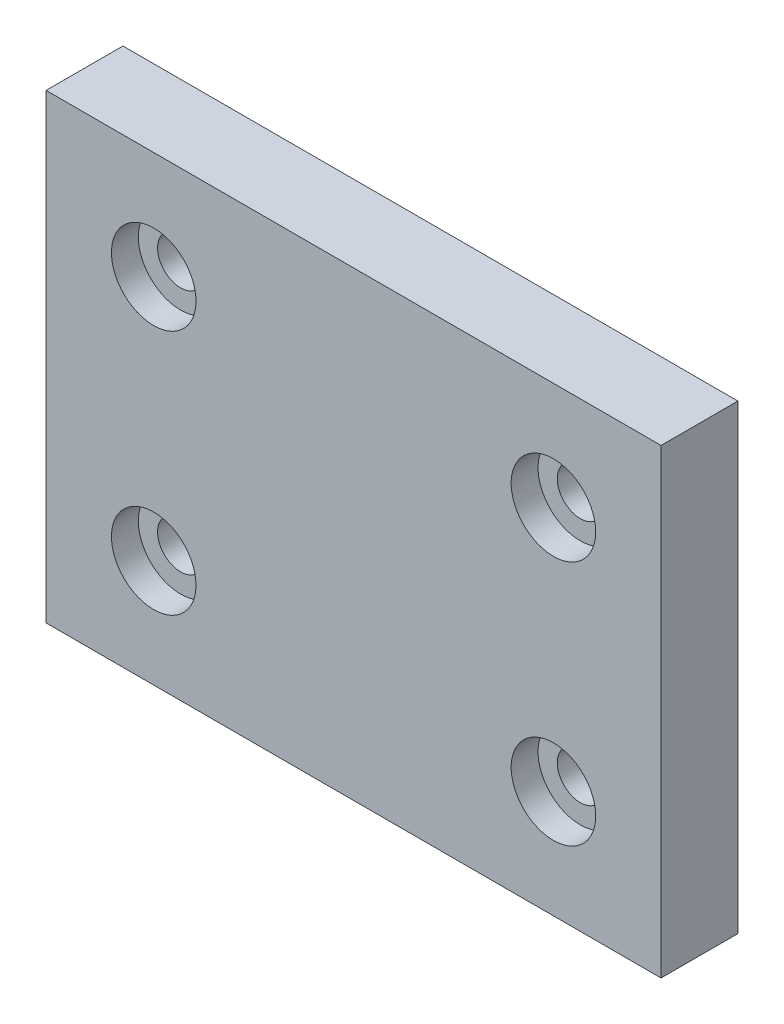
ISO-10303-21;
HEADER;
FILE_DESCRIPTION(('STEP AP214'),'2;1');
FILE_NAME('part.step','',(''),(''),'','','');
FILE_SCHEMA(('AUTOMOTIVE_DESIGN { 1 0 10303 214 1 1 1 1 }'));
ENDSEC;
DATA;
#1=APPLICATION_CONTEXT('core data for automotive mechanical design processes');
#2=APPLICATION_PROTOCOL_DEFINITION('international standard','automotive_design',2000,#1);
#3=PRODUCT_CONTEXT('',#1,'mechanical');
#4=PRODUCT('Part','Part','',(#3));
#5=PRODUCT_RELATED_PRODUCT_CATEGORY('part','',(#4));
#6=PRODUCT_DEFINITION_FORMATION('','',#4);
#7=PRODUCT_DEFINITION_CONTEXT('part definition',#1,'design');
#8=PRODUCT_DEFINITION('design','',#6,#7);
#9=PRODUCT_DEFINITION_SHAPE('','',#8);
#10=(LENGTH_UNIT() NAMED_UNIT(*) SI_UNIT(.MILLI.,.METRE.));
#11=(NAMED_UNIT(*) PLANE_ANGLE_UNIT() SI_UNIT($,.RADIAN.));
#12=(NAMED_UNIT(*) SI_UNIT($,.STERADIAN.) SOLID_ANGLE_UNIT());
#13=UNCERTAINTY_MEASURE_WITH_UNIT(LENGTH_MEASURE(1.E-05),#10,'distance_accuracy_value','');
#14=(GEOMETRIC_REPRESENTATION_CONTEXT(3) GLOBAL_UNCERTAINTY_ASSIGNED_CONTEXT((#13)) GLOBAL_UNIT_ASSIGNED_CONTEXT((#10,
#11,#12)) REPRESENTATION_CONTEXT('',''));
#15=CARTESIAN_POINT('',(0.,0.,0.));
#16=DIRECTION('',(0.,0.,1.));
#17=DIRECTION('',(1.,0.,0.));
#18=AXIS2_PLACEMENT_3D('',#15,#16,#17);
#19=CARTESIAN_POINT('',(-40.,30.,10.));
#20=DIRECTION('',(1.,0.,0.));
#21=DIRECTION('',(0.,0.,-1.));
#22=AXIS2_PLACEMENT_3D('',#19,#20,#21);
#23=PLANE('',#22);
#24=DIRECTION('',(0.,-1.,0.));
#25=VECTOR('',#24,1.);
#26=CARTESIAN_POINT('',(-40.,30.,0.));
#27=LINE('',#26,#25);
#28=CARTESIAN_POINT('',(-40.,30.,0.));
#29=VERTEX_POINT('',#28);
#30=CARTESIAN_POINT('',(-40.,-30.,0.));
#31=VERTEX_POINT('',#30);
#32=EDGE_CURVE('E125',#29,#31,#27,.T.);
#33=ORIENTED_EDGE('',*,*,#32,.T.);
#34=DIRECTION('',(0.,0.,-1.));
#35=VECTOR('',#34,1.);
#36=CARTESIAN_POINT('',(-40.,-30.,10.));
#37=LINE('',#36,#35);
#38=CARTESIAN_POINT('',(-40.,-30.,10.));
#39=VERTEX_POINT('',#38);
#40=EDGE_CURVE('E11',#39,#31,#37,.T.);
#41=ORIENTED_EDGE('',*,*,#40,.F.);
#42=DIRECTION('',(0.,-1.,0.));
#43=VECTOR('',#42,1.);
#44=CARTESIAN_POINT('',(-40.,30.,10.));
#45=LINE('',#44,#43);
#46=CARTESIAN_POINT('',(-40.,30.,10.));
#47=VERTEX_POINT('',#46);
#48=EDGE_CURVE('E106',#47,#39,#45,.T.);
#49=ORIENTED_EDGE('',*,*,#48,.F.);
#50=DIRECTION('',(0.,0.,-1.));
#51=VECTOR('',#50,1.);
#52=CARTESIAN_POINT('',(-40.,30.,10.));
#53=LINE('',#52,#51);
#54=EDGE_CURVE('E121',#47,#29,#53,.T.);
#55=ORIENTED_EDGE('',*,*,#54,.T.);
#56=EDGE_LOOP('',(#33,#41,#49,#55));
#57=FACE_BOUND('',#56,.T.);
#58=ADVANCED_FACE('F51',(#57),#23,.F.);
#59=CARTESIAN_POINT('',(-40.,-30.,10.));
#60=DIRECTION('',(0.,1.,0.));
#61=DIRECTION('',(0.,0.,1.));
#62=AXIS2_PLACEMENT_3D('',#59,#60,#61);
#63=PLANE('',#62);
#64=DIRECTION('',(1.,0.,0.));
#65=VECTOR('',#64,1.);
#66=CARTESIAN_POINT('',(-40.,-30.,0.));
#67=LINE('',#66,#65);
#68=CARTESIAN_POINT('',(40.,-30.,0.));
#69=VERTEX_POINT('',#68);
#70=EDGE_CURVE('E111',#31,#69,#67,.T.);
#71=ORIENTED_EDGE('',*,*,#70,.T.);
#72=DIRECTION('',(0.,0.,-1.));
#73=VECTOR('',#72,1.);
#74=CARTESIAN_POINT('',(40.,-30.,10.));
#75=LINE('',#74,#73);
#76=CARTESIAN_POINT('',(40.,-30.,10.));
#77=VERTEX_POINT('',#76);
#78=EDGE_CURVE('E62',#77,#69,#75,.T.);
#79=ORIENTED_EDGE('',*,*,#78,.F.);
#80=DIRECTION('',(1.,0.,0.));
#81=VECTOR('',#80,1.);
#82=CARTESIAN_POINT('',(-40.,-30.,10.));
#83=LINE('',#82,#81);
#84=EDGE_CURVE('E101',#39,#77,#83,.T.);
#85=ORIENTED_EDGE('',*,*,#84,.F.);
#86=ORIENTED_EDGE('',*,*,#40,.T.);
#87=EDGE_LOOP('',(#71,#79,#85,#86));
#88=FACE_BOUND('',#87,.T.);
#89=ADVANCED_FACE('F110',(#88),#63,.F.);
#90=CARTESIAN_POINT('',(40.,-30.,10.));
#91=DIRECTION('',(-1.,0.,0.));
#92=DIRECTION('',(0.,0.,1.));
#93=AXIS2_PLACEMENT_3D('',#90,#91,#92);
#94=PLANE('',#93);
#95=DIRECTION('',(0.,1.,0.));
#96=VECTOR('',#95,1.);
#97=CARTESIAN_POINT('',(40.,-30.,0.));
#98=LINE('',#97,#96);
#99=CARTESIAN_POINT('',(40.,30.,0.));
#100=VERTEX_POINT('',#99);
#101=EDGE_CURVE('E88',#69,#100,#98,.T.);
#102=ORIENTED_EDGE('',*,*,#101,.T.);
#103=DIRECTION('',(0.,0.,-1.));
#104=VECTOR('',#103,1.);
#105=CARTESIAN_POINT('',(40.,30.,10.));
#106=LINE('',#105,#104);
#107=CARTESIAN_POINT('',(40.,30.,10.));
#108=VERTEX_POINT('',#107);
#109=EDGE_CURVE('E113',#108,#100,#106,.T.);
#110=ORIENTED_EDGE('',*,*,#109,.F.);
#111=DIRECTION('',(0.,1.,0.));
#112=VECTOR('',#111,1.);
#113=CARTESIAN_POINT('',(40.,-30.,10.));
#114=LINE('',#113,#112);
#115=EDGE_CURVE('E104',#77,#108,#114,.T.);
#116=ORIENTED_EDGE('',*,*,#115,.F.);
#117=ORIENTED_EDGE('',*,*,#78,.T.);
#118=EDGE_LOOP('',(#102,#110,#116,#117));
#119=FACE_BOUND('',#118,.T.);
#120=ADVANCED_FACE('F115',(#119),#94,.F.);
#121=CARTESIAN_POINT('',(40.,30.,10.));
#122=DIRECTION('',(0.,-1.,0.));
#123=DIRECTION('',(0.,0.,-1.));
#124=AXIS2_PLACEMENT_3D('',#121,#122,#123);
#125=PLANE('',#124);
#126=DIRECTION('',(-1.,0.,0.));
#127=VECTOR('',#126,1.);
#128=CARTESIAN_POINT('',(40.,30.,0.));
#129=LINE('',#128,#127);
#130=EDGE_CURVE('E94',#100,#29,#129,.T.);
#131=ORIENTED_EDGE('',*,*,#130,.T.);
#132=ORIENTED_EDGE('',*,*,#54,.F.);
#133=DIRECTION('',(-1.,0.,0.));
#134=VECTOR('',#133,1.);
#135=CARTESIAN_POINT('',(40.,30.,10.));
#136=LINE('',#135,#134);
#137=EDGE_CURVE('E71',#108,#47,#136,.T.);
#138=ORIENTED_EDGE('',*,*,#137,.F.);
#139=ORIENTED_EDGE('',*,*,#109,.T.);
#140=EDGE_LOOP('',(#131,#132,#138,#139));
#141=FACE_BOUND('',#140,.T.);
#142=ADVANCED_FACE('F196',(#141),#125,.F.);
#143=CARTESIAN_POINT('',(0.,0.,10.));
#144=DIRECTION('',(0.,0.,1.));
#145=DIRECTION('',(1.,0.,0.));
#146=AXIS2_PLACEMENT_3D('',#143,#144,#145);
#147=PLANE('',#146);
#148=CARTESIAN_POINT('',(26.,-16.,10.));
#149=DIRECTION('',(0.,0.,1.));
#150=DIRECTION('',(1.,0.,0.));
#151=AXIS2_PLACEMENT_3D('',#148,#149,#150);
#152=CIRCLE('',#151,5.5);
#153=CARTESIAN_POINT('',(31.5,-16.,10.));
#154=VERTEX_POINT('',#153);
#155=EDGE_CURVE('E170',#154,#154,#152,.T.);
#156=ORIENTED_EDGE('',*,*,#155,.F.);
#157=EDGE_LOOP('',(#156));
#158=FACE_BOUND('',#157,.T.);
#159=CARTESIAN_POINT('',(-26.,16.,10.));
#160=DIRECTION('',(0.,0.,1.));
#161=DIRECTION('',(1.,0.,0.));
#162=AXIS2_PLACEMENT_3D('',#159,#160,#161);
#163=CIRCLE('',#162,5.5);
#164=CARTESIAN_POINT('',(-20.5,16.,10.));
#165=VERTEX_POINT('',#164);
#166=EDGE_CURVE('E179',#165,#165,#163,.T.);
#167=ORIENTED_EDGE('',*,*,#166,.F.);
#168=EDGE_LOOP('',(#167));
#169=FACE_BOUND('',#168,.T.);
#170=CARTESIAN_POINT('',(-26.,-16.,10.));
#171=DIRECTION('',(0.,0.,1.));
#172=DIRECTION('',(1.,0.,0.));
#173=AXIS2_PLACEMENT_3D('',#170,#171,#172);
#174=CIRCLE('',#173,5.5);
#175=CARTESIAN_POINT('',(-20.5,-16.,10.));
#176=VERTEX_POINT('',#175);
#177=EDGE_CURVE('E160',#176,#176,#174,.T.);
#178=ORIENTED_EDGE('',*,*,#177,.F.);
#179=EDGE_LOOP('',(#178));
#180=FACE_BOUND('',#179,.T.);
#181=CARTESIAN_POINT('',(26.,16.,10.));
#182=DIRECTION('',(0.,0.,1.));
#183=DIRECTION('',(1.,0.,0.));
#184=AXIS2_PLACEMENT_3D('',#181,#182,#183);
#185=CIRCLE('',#184,5.5);
#186=CARTESIAN_POINT('',(31.5,16.,10.));
#187=VERTEX_POINT('',#186);
#188=EDGE_CURVE('E174',#187,#187,#185,.T.);
#189=ORIENTED_EDGE('',*,*,#188,.F.);
#190=EDGE_LOOP('',(#189));
#191=FACE_BOUND('',#190,.T.);
#192=ORIENTED_EDGE('',*,*,#48,.T.);
#193=ORIENTED_EDGE('',*,*,#84,.T.);
#194=ORIENTED_EDGE('',*,*,#115,.T.);
#195=ORIENTED_EDGE('',*,*,#137,.T.);
#196=EDGE_LOOP('',(#192,#193,#194,#195));
#197=FACE_BOUND('',#196,.T.);
#198=ADVANCED_FACE('F102',(#158,#169,#180,#191,#197),#147,.T.);
#199=CARTESIAN_POINT('',(0.,0.,0.));
#200=DIRECTION('',(0.,0.,1.));
#201=DIRECTION('',(1.,0.,0.));
#202=AXIS2_PLACEMENT_3D('',#199,#200,#201);
#203=PLANE('',#202);
#204=CARTESIAN_POINT('',(26.,-16.,0.));
#205=DIRECTION('',(0.,0.,1.));
#206=DIRECTION('',(1.,0.,0.));
#207=AXIS2_PLACEMENT_3D('',#204,#205,#206);
#208=CIRCLE('',#207,3.);
#209=CARTESIAN_POINT('',(29.,-16.,0.));
#210=VERTEX_POINT('',#209);
#211=EDGE_CURVE('E264',#210,#210,#208,.T.);
#212=ORIENTED_EDGE('',*,*,#211,.T.);
#213=EDGE_LOOP('',(#212));
#214=FACE_BOUND('',#213,.T.);
#215=CARTESIAN_POINT('',(-26.,16.,0.));
#216=DIRECTION('',(0.,0.,1.));
#217=DIRECTION('',(1.,0.,0.));
#218=AXIS2_PLACEMENT_3D('',#215,#216,#217);
#219=CIRCLE('',#218,3.);
#220=CARTESIAN_POINT('',(-23.,16.,0.));
#221=VERTEX_POINT('',#220);
#222=EDGE_CURVE('E267',#221,#221,#219,.T.);
#223=ORIENTED_EDGE('',*,*,#222,.T.);
#224=EDGE_LOOP('',(#223));
#225=FACE_BOUND('',#224,.T.);
#226=CARTESIAN_POINT('',(-26.,-16.,0.));
#227=DIRECTION('',(0.,0.,1.));
#228=DIRECTION('',(1.,0.,0.));
#229=AXIS2_PLACEMENT_3D('',#226,#227,#228);
#230=CIRCLE('',#229,3.);
#231=CARTESIAN_POINT('',(-23.,-16.,0.));
#232=VERTEX_POINT('',#231);
#233=EDGE_CURVE('E272',#232,#232,#230,.T.);
#234=ORIENTED_EDGE('',*,*,#233,.T.);
#235=EDGE_LOOP('',(#234));
#236=FACE_BOUND('',#235,.T.);
#237=CARTESIAN_POINT('',(26.,16.,0.));
#238=DIRECTION('',(0.,0.,1.));
#239=DIRECTION('',(1.,0.,0.));
#240=AXIS2_PLACEMENT_3D('',#237,#238,#239);
#241=CIRCLE('',#240,3.);
#242=CARTESIAN_POINT('',(29.,16.,0.));
#243=VERTEX_POINT('',#242);
#244=EDGE_CURVE('E145',#243,#243,#241,.T.);
#245=ORIENTED_EDGE('',*,*,#244,.T.);
#246=EDGE_LOOP('',(#245));
#247=FACE_BOUND('',#246,.T.);
#248=ORIENTED_EDGE('',*,*,#32,.F.);
#249=ORIENTED_EDGE('',*,*,#130,.F.);
#250=ORIENTED_EDGE('',*,*,#101,.F.);
#251=ORIENTED_EDGE('',*,*,#70,.F.);
#252=EDGE_LOOP('',(#248,#249,#250,#251));
#253=FACE_BOUND('',#252,.T.);
#254=ADVANCED_FACE('F195',(#214,#225,#236,#247,#253),#203,.F.);
#255=CARTESIAN_POINT('',(26.,16.,6.5));
#256=DIRECTION('',(0.,0.,1.));
#257=DIRECTION('',(1.,0.,0.));
#258=AXIS2_PLACEMENT_3D('',#255,#256,#257);
#259=CYLINDRICAL_SURFACE('',#258,5.5);
#260=CARTESIAN_POINT('',(26.,16.,6.5));
#261=DIRECTION('',(0.,0.,1.));
#262=DIRECTION('',(1.,0.,0.));
#263=AXIS2_PLACEMENT_3D('',#260,#261,#262);
#264=CIRCLE('',#263,5.5);
#265=CARTESIAN_POINT('',(31.5,16.,6.5));
#266=VERTEX_POINT('',#265);
#267=EDGE_CURVE('E129',#266,#266,#264,.T.);
#268=ORIENTED_EDGE('',*,*,#267,.F.);
#269=EDGE_LOOP('',(#268));
#270=FACE_BOUND('',#269,.T.);
#271=ORIENTED_EDGE('',*,*,#188,.T.);
#272=EDGE_LOOP('',(#271));
#273=FACE_BOUND('',#272,.T.);
#274=ADVANCED_FACE('F192',(#270,#273),#259,.F.);
#275=CARTESIAN_POINT('',(26.,16.,6.5));
#276=DIRECTION('',(0.,0.,1.));
#277=DIRECTION('',(1.,0.,0.));
#278=AXIS2_PLACEMENT_3D('',#275,#276,#277);
#279=PLANE('',#278);
#280=CARTESIAN_POINT('',(26.,16.,6.5));
#281=DIRECTION('',(0.,0.,1.));
#282=DIRECTION('',(1.,0.,0.));
#283=AXIS2_PLACEMENT_3D('',#280,#281,#282);
#284=CIRCLE('',#283,3.);
#285=CARTESIAN_POINT('',(29.,16.,6.5));
#286=VERTEX_POINT('',#285);
#287=EDGE_CURVE('E55',#286,#286,#284,.T.);
#288=ORIENTED_EDGE('',*,*,#287,.F.);
#289=EDGE_LOOP('',(#288));
#290=FACE_BOUND('',#289,.T.);
#291=ORIENTED_EDGE('',*,*,#267,.T.);
#292=EDGE_LOOP('',(#291));
#293=FACE_BOUND('',#292,.T.);
#294=ADVANCED_FACE('F226',(#290,#293),#279,.T.);
#295=CARTESIAN_POINT('',(-26.,-16.,6.5));
#296=DIRECTION('',(0.,0.,1.));
#297=DIRECTION('',(1.,0.,0.));
#298=AXIS2_PLACEMENT_3D('',#295,#296,#297);
#299=CYLINDRICAL_SURFACE('',#298,5.5);
#300=CARTESIAN_POINT('',(-26.,-16.,6.5));
#301=DIRECTION('',(0.,0.,1.));
#302=DIRECTION('',(1.,0.,0.));
#303=AXIS2_PLACEMENT_3D('',#300,#301,#302);
#304=CIRCLE('',#303,5.5);
#305=CARTESIAN_POINT('',(-20.5,-16.,6.5));
#306=VERTEX_POINT('',#305);
#307=EDGE_CURVE('E155',#306,#306,#304,.T.);
#308=ORIENTED_EDGE('',*,*,#307,.F.);
#309=EDGE_LOOP('',(#308));
#310=FACE_BOUND('',#309,.T.);
#311=ORIENTED_EDGE('',*,*,#177,.T.);
#312=EDGE_LOOP('',(#311));
#313=FACE_BOUND('',#312,.T.);
#314=ADVANCED_FACE('F230',(#310,#313),#299,.F.);
#315=CARTESIAN_POINT('',(-26.,-16.,6.5));
#316=DIRECTION('',(0.,0.,1.));
#317=DIRECTION('',(1.,0.,0.));
#318=AXIS2_PLACEMENT_3D('',#315,#316,#317);
#319=PLANE('',#318);
#320=CARTESIAN_POINT('',(-26.,-16.,6.5));
#321=DIRECTION('',(0.,0.,1.));
#322=DIRECTION('',(1.,0.,0.));
#323=AXIS2_PLACEMENT_3D('',#320,#321,#322);
#324=CIRCLE('',#323,3.);
#325=CARTESIAN_POINT('',(-23.,-16.,6.5));
#326=VERTEX_POINT('',#325);
#327=EDGE_CURVE('E148',#326,#326,#324,.T.);
#328=ORIENTED_EDGE('',*,*,#327,.F.);
#329=EDGE_LOOP('',(#328));
#330=FACE_BOUND('',#329,.T.);
#331=ORIENTED_EDGE('',*,*,#307,.T.);
#332=EDGE_LOOP('',(#331));
#333=FACE_BOUND('',#332,.T.);
#334=ADVANCED_FACE('F234',(#330,#333),#319,.T.);
#335=CARTESIAN_POINT('',(-26.,16.,6.5));
#336=DIRECTION('',(0.,0.,1.));
#337=DIRECTION('',(1.,0.,0.));
#338=AXIS2_PLACEMENT_3D('',#335,#336,#337);
#339=CYLINDRICAL_SURFACE('',#338,5.5);
#340=CARTESIAN_POINT('',(-26.,16.,6.5));
#341=DIRECTION('',(0.,0.,1.));
#342=DIRECTION('',(1.,0.,0.));
#343=AXIS2_PLACEMENT_3D('',#340,#341,#342);
#344=CIRCLE('',#343,5.5);
#345=CARTESIAN_POINT('',(-20.5,16.,6.5));
#346=VERTEX_POINT('',#345);
#347=EDGE_CURVE('E166',#346,#346,#344,.T.);
#348=ORIENTED_EDGE('',*,*,#347,.F.);
#349=EDGE_LOOP('',(#348));
#350=FACE_BOUND('',#349,.T.);
#351=ORIENTED_EDGE('',*,*,#166,.T.);
#352=EDGE_LOOP('',(#351));
#353=FACE_BOUND('',#352,.T.);
#354=ADVANCED_FACE('F238',(#350,#353),#339,.F.);
#355=CARTESIAN_POINT('',(-26.,16.,6.5));
#356=DIRECTION('',(0.,0.,1.));
#357=DIRECTION('',(1.,0.,0.));
#358=AXIS2_PLACEMENT_3D('',#355,#356,#357);
#359=PLANE('',#358);
#360=CARTESIAN_POINT('',(-26.,16.,6.5));
#361=DIRECTION('',(0.,0.,1.));
#362=DIRECTION('',(1.,0.,0.));
#363=AXIS2_PLACEMENT_3D('',#360,#361,#362);
#364=CIRCLE('',#363,3.);
#365=CARTESIAN_POINT('',(-23.,16.,6.5));
#366=VERTEX_POINT('',#365);
#367=EDGE_CURVE('E144',#366,#366,#364,.T.);
#368=ORIENTED_EDGE('',*,*,#367,.F.);
#369=EDGE_LOOP('',(#368));
#370=FACE_BOUND('',#369,.T.);
#371=ORIENTED_EDGE('',*,*,#347,.T.);
#372=EDGE_LOOP('',(#371));
#373=FACE_BOUND('',#372,.T.);
#374=ADVANCED_FACE('F241',(#370,#373),#359,.T.);
#375=CARTESIAN_POINT('',(26.,-16.,6.5));
#376=DIRECTION('',(0.,0.,1.));
#377=DIRECTION('',(1.,0.,0.));
#378=AXIS2_PLACEMENT_3D('',#375,#376,#377);
#379=CYLINDRICAL_SURFACE('',#378,5.5);
#380=CARTESIAN_POINT('',(26.,-16.,6.5));
#381=DIRECTION('',(0.,0.,1.));
#382=DIRECTION('',(1.,0.,0.));
#383=AXIS2_PLACEMENT_3D('',#380,#381,#382);
#384=CIRCLE('',#383,5.5);
#385=CARTESIAN_POINT('',(31.5,-16.,6.5));
#386=VERTEX_POINT('',#385);
#387=EDGE_CURVE('E175',#386,#386,#384,.T.);
#388=ORIENTED_EDGE('',*,*,#387,.F.);
#389=EDGE_LOOP('',(#388));
#390=FACE_BOUND('',#389,.T.);
#391=ORIENTED_EDGE('',*,*,#155,.T.);
#392=EDGE_LOOP('',(#391));
#393=FACE_BOUND('',#392,.T.);
#394=ADVANCED_FACE('F243',(#390,#393),#379,.F.);
#395=CARTESIAN_POINT('',(26.,-16.,6.5));
#396=DIRECTION('',(0.,0.,1.));
#397=DIRECTION('',(1.,0.,0.));
#398=AXIS2_PLACEMENT_3D('',#395,#396,#397);
#399=PLANE('',#398);
#400=CARTESIAN_POINT('',(26.,-16.,6.5));
#401=DIRECTION('',(0.,0.,1.));
#402=DIRECTION('',(1.,0.,0.));
#403=AXIS2_PLACEMENT_3D('',#400,#401,#402);
#404=CIRCLE('',#403,3.);
#405=CARTESIAN_POINT('',(29.,-16.,6.5));
#406=VERTEX_POINT('',#405);
#407=EDGE_CURVE('E140',#406,#406,#404,.T.);
#408=ORIENTED_EDGE('',*,*,#407,.F.);
#409=EDGE_LOOP('',(#408));
#410=FACE_BOUND('',#409,.T.);
#411=ORIENTED_EDGE('',*,*,#387,.T.);
#412=EDGE_LOOP('',(#411));
#413=FACE_BOUND('',#412,.T.);
#414=ADVANCED_FACE('F245',(#410,#413),#399,.T.);
#415=CARTESIAN_POINT('',(26.,-16.,0.));
#416=DIRECTION('',(0.,0.,1.));
#417=DIRECTION('',(1.,0.,0.));
#418=AXIS2_PLACEMENT_3D('',#415,#416,#417);
#419=CYLINDRICAL_SURFACE('',#418,3.);
#420=ORIENTED_EDGE('',*,*,#407,.T.);
#421=EDGE_LOOP('',(#420));
#422=FACE_BOUND('',#421,.T.);
#423=ORIENTED_EDGE('',*,*,#211,.F.);
#424=EDGE_LOOP('',(#423));
#425=FACE_BOUND('',#424,.T.);
#426=ADVANCED_FACE('F248',(#422,#425),#419,.F.);
#427=CARTESIAN_POINT('',(-26.,16.,0.));
#428=DIRECTION('',(0.,0.,1.));
#429=DIRECTION('',(1.,0.,0.));
#430=AXIS2_PLACEMENT_3D('',#427,#428,#429);
#431=CYLINDRICAL_SURFACE('',#430,3.);
#432=ORIENTED_EDGE('',*,*,#367,.T.);
#433=EDGE_LOOP('',(#432));
#434=FACE_BOUND('',#433,.T.);
#435=ORIENTED_EDGE('',*,*,#222,.F.);
#436=EDGE_LOOP('',(#435));
#437=FACE_BOUND('',#436,.T.);
#438=ADVANCED_FACE('F252',(#434,#437),#431,.F.);
#439=CARTESIAN_POINT('',(-26.,-16.,0.));
#440=DIRECTION('',(0.,0.,1.));
#441=DIRECTION('',(1.,0.,0.));
#442=AXIS2_PLACEMENT_3D('',#439,#440,#441);
#443=CYLINDRICAL_SURFACE('',#442,3.);
#444=ORIENTED_EDGE('',*,*,#327,.T.);
#445=EDGE_LOOP('',(#444));
#446=FACE_BOUND('',#445,.T.);
#447=ORIENTED_EDGE('',*,*,#233,.F.);
#448=EDGE_LOOP('',(#447));
#449=FACE_BOUND('',#448,.T.);
#450=ADVANCED_FACE('F254',(#446,#449),#443,.F.);
#451=CARTESIAN_POINT('',(26.,16.,0.));
#452=DIRECTION('',(0.,0.,1.));
#453=DIRECTION('',(1.,0.,0.));
#454=AXIS2_PLACEMENT_3D('',#451,#452,#453);
#455=CYLINDRICAL_SURFACE('',#454,3.);
#456=ORIENTED_EDGE('',*,*,#287,.T.);
#457=EDGE_LOOP('',(#456));
#458=FACE_BOUND('',#457,.T.);
#459=ORIENTED_EDGE('',*,*,#244,.F.);
#460=EDGE_LOOP('',(#459));
#461=FACE_BOUND('',#460,.T.);
#462=ADVANCED_FACE('F255',(#458,#461),#455,.F.);
#463=CLOSED_SHELL('',(#58,#89,#120,#142,#198,#254,#274,#294,#314,#334,#354,#374,#394,#414,#426,
#438,#450,#462));
#464=MANIFOLD_SOLID_BREP('B2',#463);
#465=ADVANCED_BREP_SHAPE_REPRESENTATION('',(#18,#464),#14);
#466=SHAPE_DEFINITION_REPRESENTATION(#9,#465);
ENDSEC;
END-ISO-10303-21;
